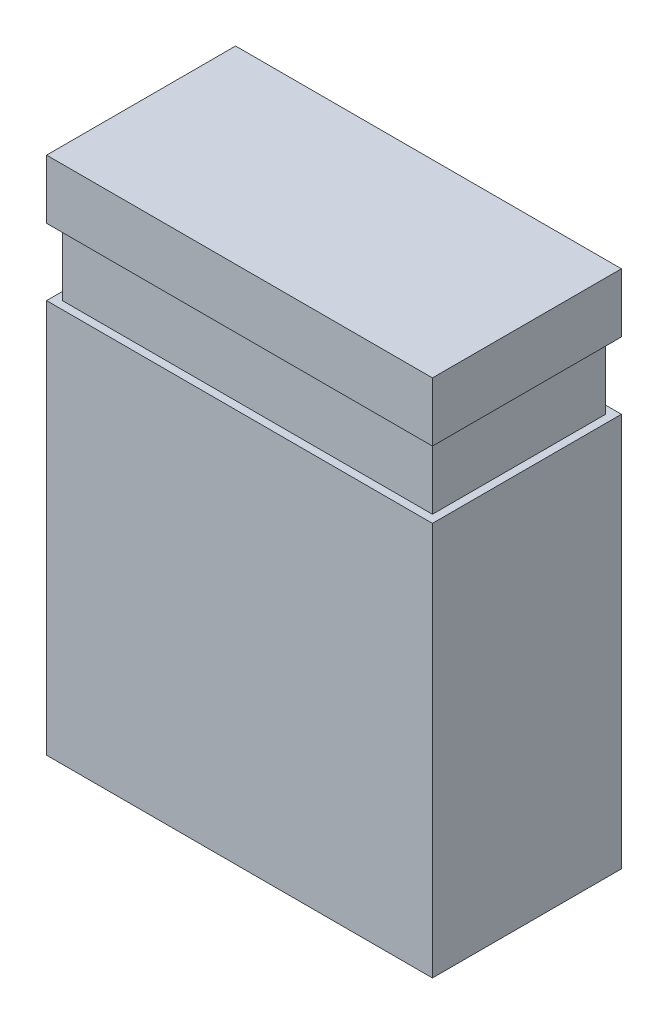
ISO-10303-21;
HEADER;
FILE_DESCRIPTION(('STEP AP214'),'2;1');
FILE_NAME('part.step','',(''),(''),'','','');
FILE_SCHEMA(('AUTOMOTIVE_DESIGN { 1 0 10303 214 1 1 1 1 }'));
ENDSEC;
DATA;
#1=APPLICATION_CONTEXT('core data for automotive mechanical design processes');
#2=APPLICATION_PROTOCOL_DEFINITION('international standard','automotive_design',2000,#1);
#3=PRODUCT_CONTEXT('',#1,'mechanical');
#4=PRODUCT('Part','Part','',(#3));
#5=PRODUCT_RELATED_PRODUCT_CATEGORY('part','',(#4));
#6=PRODUCT_DEFINITION_FORMATION('','',#4);
#7=PRODUCT_DEFINITION_CONTEXT('part definition',#1,'design');
#8=PRODUCT_DEFINITION('design','',#6,#7);
#9=PRODUCT_DEFINITION_SHAPE('','',#8);
#10=(LENGTH_UNIT() NAMED_UNIT(*) SI_UNIT(.MILLI.,.METRE.));
#11=(NAMED_UNIT(*) PLANE_ANGLE_UNIT() SI_UNIT($,.RADIAN.));
#12=(NAMED_UNIT(*) SI_UNIT($,.STERADIAN.) SOLID_ANGLE_UNIT());
#13=UNCERTAINTY_MEASURE_WITH_UNIT(LENGTH_MEASURE(1.E-05),#10,'distance_accuracy_value','');
#14=(GEOMETRIC_REPRESENTATION_CONTEXT(3) GLOBAL_UNCERTAINTY_ASSIGNED_CONTEXT((#13)) GLOBAL_UNIT_ASSIGNED_CONTEXT((#10,
#11,#12)) REPRESENTATION_CONTEXT('',''));
#15=CARTESIAN_POINT('',(0.,0.,0.));
#16=DIRECTION('',(0.,0.,1.));
#17=DIRECTION('',(1.,0.,0.));
#18=AXIS2_PLACEMENT_3D('',#15,#16,#17);
#19=CARTESIAN_POINT('',(-4.9,0.,2.4));
#20=DIRECTION('',(1.,0.,0.));
#21=DIRECTION('',(0.,0.,-1.));
#22=AXIS2_PLACEMENT_3D('',#19,#20,#21);
#23=PLANE('',#22);
#24=DIRECTION('',(0.,-1.,0.));
#25=VECTOR('',#24,1.);
#26=CARTESIAN_POINT('',(-4.9,0.,0.));
#27=LINE('',#26,#25);
#28=CARTESIAN_POINT('',(-4.9,6.6,0.));
#29=VERTEX_POINT('',#28);
#30=CARTESIAN_POINT('',(-4.9,5.85,0.));
#31=VERTEX_POINT('',#30);
#32=EDGE_CURVE('E196',#29,#31,#27,.T.);
#33=ORIENTED_EDGE('',*,*,#32,.T.);
#34=DIRECTION('',(0.,0.,1.));
#35=VECTOR('',#34,1.);
#36=CARTESIAN_POINT('',(-4.9,5.85,2.3));
#37=LINE('',#36,#35);
#38=CARTESIAN_POINT('',(-4.9,5.85,2.4));
#39=VERTEX_POINT('',#38);
#40=EDGE_CURVE('E167',#31,#39,#37,.T.);
#41=ORIENTED_EDGE('',*,*,#40,.T.);
#42=DIRECTION('',(0.,-1.,0.));
#43=VECTOR('',#42,1.);
#44=CARTESIAN_POINT('',(-4.9,0.,2.4));
#45=LINE('',#44,#43);
#46=CARTESIAN_POINT('',(-4.9,6.6,2.4));
#47=VERTEX_POINT('',#46);
#48=EDGE_CURVE('E184',#47,#39,#45,.T.);
#49=ORIENTED_EDGE('',*,*,#48,.F.);
#50=DIRECTION('',(0.,0.,-1.));
#51=VECTOR('',#50,1.);
#52=CARTESIAN_POINT('',(-4.9,6.6,2.4));
#53=LINE('',#52,#51);
#54=EDGE_CURVE('E42',#47,#29,#53,.T.);
#55=ORIENTED_EDGE('',*,*,#54,.T.);
#56=EDGE_LOOP('',(#33,#41,#49,#55));
#57=FACE_BOUND('',#56,.T.);
#58=ADVANCED_FACE('F34',(#57),#23,.F.);
#59=CARTESIAN_POINT('',(0.,0.,0.));
#60=DIRECTION('',(0.,0.,1.));
#61=DIRECTION('',(1.,0.,0.));
#62=AXIS2_PLACEMENT_3D('',#59,#60,#61);
#63=PLANE('',#62);
#64=DIRECTION('',(1.,0.,0.));
#65=VECTOR('',#64,1.);
#66=CARTESIAN_POINT('',(-0.1,5.85,0.));
#67=LINE('',#66,#65);
#68=CARTESIAN_POINT('',(0.,5.85,0.));
#69=VERTEX_POINT('',#68);
#70=EDGE_CURVE('E153',#31,#69,#67,.T.);
#71=ORIENTED_EDGE('',*,*,#70,.F.);
#72=ORIENTED_EDGE('',*,*,#32,.F.);
#73=DIRECTION('',(-1.,0.,0.));
#74=VECTOR('',#73,1.);
#75=CARTESIAN_POINT('',(0.,6.6,0.));
#76=LINE('',#75,#74);
#77=CARTESIAN_POINT('',(0.,6.6,0.));
#78=VERTEX_POINT('',#77);
#79=EDGE_CURVE('E193',#78,#29,#76,.T.);
#80=ORIENTED_EDGE('',*,*,#79,.F.);
#81=DIRECTION('',(0.,1.,0.));
#82=VECTOR('',#81,1.);
#83=CARTESIAN_POINT('',(0.,0.,0.));
#84=LINE('',#83,#82);
#85=EDGE_CURVE('E170',#69,#78,#84,.T.);
#86=ORIENTED_EDGE('',*,*,#85,.F.);
#87=EDGE_LOOP('',(#71,#72,#80,#86));
#88=FACE_BOUND('',#87,.T.);
#89=ADVANCED_FACE('F215',(#88),#63,.F.);
#90=CARTESIAN_POINT('',(0.,0.,2.4));
#91=DIRECTION('',(-1.,0.,0.));
#92=DIRECTION('',(0.,0.,1.));
#93=AXIS2_PLACEMENT_3D('',#90,#91,#92);
#94=PLANE('',#93);
#95=DIRECTION('',(0.,0.,1.));
#96=VECTOR('',#95,1.);
#97=CARTESIAN_POINT('',(0.,5.85,2.3));
#98=LINE('',#97,#96);
#99=CARTESIAN_POINT('',(0.,5.85,2.4));
#100=VERTEX_POINT('',#99);
#101=EDGE_CURVE('E171',#69,#100,#98,.T.);
#102=ORIENTED_EDGE('',*,*,#101,.F.);
#103=ORIENTED_EDGE('',*,*,#85,.T.);
#104=DIRECTION('',(0.,0.,-1.));
#105=VECTOR('',#104,1.);
#106=CARTESIAN_POINT('',(0.,6.6,2.4));
#107=LINE('',#106,#105);
#108=CARTESIAN_POINT('',(0.,6.6,2.4));
#109=VERTEX_POINT('',#108);
#110=EDGE_CURVE('E11',#109,#78,#107,.T.);
#111=ORIENTED_EDGE('',*,*,#110,.F.);
#112=DIRECTION('',(0.,1.,0.));
#113=VECTOR('',#112,1.);
#114=CARTESIAN_POINT('',(0.,0.,2.4));
#115=LINE('',#114,#113);
#116=EDGE_CURVE('E181',#100,#109,#115,.T.);
#117=ORIENTED_EDGE('',*,*,#116,.F.);
#118=EDGE_LOOP('',(#102,#103,#111,#117));
#119=FACE_BOUND('',#118,.T.);
#120=ADVANCED_FACE('F227',(#119),#94,.F.);
#121=CARTESIAN_POINT('',(0.,0.,2.4));
#122=DIRECTION('',(0.,0.,1.));
#123=DIRECTION('',(1.,0.,0.));
#124=AXIS2_PLACEMENT_3D('',#121,#122,#123);
#125=PLANE('',#124);
#126=DIRECTION('',(-1.,0.,0.));
#127=VECTOR('',#126,1.);
#128=CARTESIAN_POINT('',(-4.9,5.85,2.4));
#129=LINE('',#128,#127);
#130=EDGE_CURVE('E161',#100,#39,#129,.T.);
#131=ORIENTED_EDGE('',*,*,#130,.F.);
#132=ORIENTED_EDGE('',*,*,#116,.T.);
#133=DIRECTION('',(-1.,0.,0.));
#134=VECTOR('',#133,1.);
#135=CARTESIAN_POINT('',(0.,6.6,2.4));
#136=LINE('',#135,#134);
#137=EDGE_CURVE('E180',#109,#47,#136,.T.);
#138=ORIENTED_EDGE('',*,*,#137,.T.);
#139=ORIENTED_EDGE('',*,*,#48,.T.);
#140=EDGE_LOOP('',(#131,#132,#138,#139));
#141=FACE_BOUND('',#140,.T.);
#142=ADVANCED_FACE('F222',(#141),#125,.T.);
#143=CARTESIAN_POINT('',(0.,0.,0.));
#144=VERTEX_POINT('',#143);
#145=CARTESIAN_POINT('',(0.,5.,0.));
#146=VERTEX_POINT('',#145);
#147=EDGE_CURVE('E190',#144,#146,#84,.T.);
#148=ORIENTED_EDGE('',*,*,#147,.T.);
#149=DIRECTION('',(0.,0.,1.));
#150=VECTOR('',#149,1.);
#151=CARTESIAN_POINT('',(0.,5.,2.3));
#152=LINE('',#151,#150);
#153=CARTESIAN_POINT('',(0.,5.,2.4));
#154=VERTEX_POINT('',#153);
#155=EDGE_CURVE('E173',#146,#154,#152,.T.);
#156=ORIENTED_EDGE('',*,*,#155,.T.);
#157=CARTESIAN_POINT('',(0.,0.,2.4));
#158=VERTEX_POINT('',#157);
#159=EDGE_CURVE('E177',#158,#154,#115,.T.);
#160=ORIENTED_EDGE('',*,*,#159,.F.);
#161=DIRECTION('',(0.,0.,-1.));
#162=VECTOR('',#161,1.);
#163=CARTESIAN_POINT('',(0.,0.,2.4));
#164=LINE('',#163,#162);
#165=EDGE_CURVE('E189',#158,#144,#164,.T.);
#166=ORIENTED_EDGE('',*,*,#165,.T.);
#167=EDGE_LOOP('',(#148,#156,#160,#166));
#168=FACE_BOUND('',#167,.T.);
#169=ADVANCED_FACE('F36',(#168),#94,.F.);
#170=CARTESIAN_POINT('',(0.,6.6,2.4));
#171=DIRECTION('',(0.,-1.,0.));
#172=DIRECTION('',(1.,0.,0.));
#173=AXIS2_PLACEMENT_3D('',#170,#171,#172);
#174=PLANE('',#173);
#175=ORIENTED_EDGE('',*,*,#79,.T.);
#176=ORIENTED_EDGE('',*,*,#54,.F.);
#177=ORIENTED_EDGE('',*,*,#137,.F.);
#178=ORIENTED_EDGE('',*,*,#110,.T.);
#179=EDGE_LOOP('',(#175,#176,#177,#178));
#180=FACE_BOUND('',#179,.T.);
#181=ADVANCED_FACE('F225',(#180),#174,.F.);
#182=DIRECTION('',(0.,0.,1.));
#183=VECTOR('',#182,1.);
#184=CARTESIAN_POINT('',(-4.9,5.,2.3));
#185=LINE('',#184,#183);
#186=CARTESIAN_POINT('',(-4.9,5.,0.));
#187=VERTEX_POINT('',#186);
#188=CARTESIAN_POINT('',(-4.9,5.,2.4));
#189=VERTEX_POINT('',#188);
#190=EDGE_CURVE('E164',#187,#189,#185,.T.);
#191=ORIENTED_EDGE('',*,*,#190,.F.);
#192=CARTESIAN_POINT('',(-4.9,0.,0.));
#193=VERTEX_POINT('',#192);
#194=EDGE_CURVE('E195',#187,#193,#27,.T.);
#195=ORIENTED_EDGE('',*,*,#194,.T.);
#196=DIRECTION('',(0.,0.,-1.));
#197=VECTOR('',#196,1.);
#198=CARTESIAN_POINT('',(-4.9,0.,2.4));
#199=LINE('',#198,#197);
#200=CARTESIAN_POINT('',(-4.9,0.,2.4));
#201=VERTEX_POINT('',#200);
#202=EDGE_CURVE('E203',#201,#193,#199,.T.);
#203=ORIENTED_EDGE('',*,*,#202,.F.);
#204=EDGE_CURVE('E183',#189,#201,#45,.T.);
#205=ORIENTED_EDGE('',*,*,#204,.F.);
#206=EDGE_LOOP('',(#191,#195,#203,#205));
#207=FACE_BOUND('',#206,.T.);
#208=ADVANCED_FACE('F241',(#207),#23,.F.);
#209=CARTESIAN_POINT('',(0.,0.,2.4));
#210=DIRECTION('',(0.,1.,0.));
#211=DIRECTION('',(0.,0.,1.));
#212=AXIS2_PLACEMENT_3D('',#209,#210,#211);
#213=PLANE('',#212);
#214=DIRECTION('',(1.,0.,0.));
#215=VECTOR('',#214,1.);
#216=CARTESIAN_POINT('',(0.,0.,0.));
#217=LINE('',#216,#215);
#218=EDGE_CURVE('E199',#193,#144,#217,.T.);
#219=ORIENTED_EDGE('',*,*,#218,.T.);
#220=ORIENTED_EDGE('',*,*,#165,.F.);
#221=DIRECTION('',(1.,0.,0.));
#222=VECTOR('',#221,1.);
#223=CARTESIAN_POINT('',(0.,0.,2.4));
#224=LINE('',#223,#222);
#225=EDGE_CURVE('E187',#201,#158,#224,.T.);
#226=ORIENTED_EDGE('',*,*,#225,.F.);
#227=ORIENTED_EDGE('',*,*,#202,.T.);
#228=EDGE_LOOP('',(#219,#220,#226,#227));
#229=FACE_BOUND('',#228,.T.);
#230=ADVANCED_FACE('F246',(#229),#213,.F.);
#231=DIRECTION('',(1.,0.,0.));
#232=VECTOR('',#231,1.);
#233=CARTESIAN_POINT('',(-4.9,5.,2.4));
#234=LINE('',#233,#232);
#235=EDGE_CURVE('E156',#189,#154,#234,.T.);
#236=ORIENTED_EDGE('',*,*,#235,.F.);
#237=ORIENTED_EDGE('',*,*,#204,.T.);
#238=ORIENTED_EDGE('',*,*,#225,.T.);
#239=ORIENTED_EDGE('',*,*,#159,.T.);
#240=EDGE_LOOP('',(#236,#237,#238,#239));
#241=FACE_BOUND('',#240,.T.);
#242=ADVANCED_FACE('F234',(#241),#125,.T.);
#243=ORIENTED_EDGE('',*,*,#194,.F.);
#244=DIRECTION('',(1.,0.,0.));
#245=VECTOR('',#244,1.);
#246=CARTESIAN_POINT('',(-0.1,5.,0.));
#247=LINE('',#246,#245);
#248=EDGE_CURVE('E152',#187,#146,#247,.T.);
#249=ORIENTED_EDGE('',*,*,#248,.T.);
#250=ORIENTED_EDGE('',*,*,#147,.F.);
#251=ORIENTED_EDGE('',*,*,#218,.F.);
#252=EDGE_LOOP('',(#243,#249,#250,#251));
#253=FACE_BOUND('',#252,.T.);
#254=ADVANCED_FACE('F236',(#253),#63,.F.);
#255=CARTESIAN_POINT('',(-4.9,5.85,2.3));
#256=DIRECTION('',(0.,1.,0.));
#257=DIRECTION('',(0.,0.,1.));
#258=AXIS2_PLACEMENT_3D('',#255,#256,#257);
#259=PLANE('',#258);
#260=ORIENTED_EDGE('',*,*,#40,.F.);
#261=ORIENTED_EDGE('',*,*,#70,.T.);
#262=ORIENTED_EDGE('',*,*,#101,.T.);
#263=ORIENTED_EDGE('',*,*,#130,.T.);
#264=EDGE_LOOP('',(#260,#261,#262,#263));
#265=FACE_BOUND('',#264,.T.);
#266=DIRECTION('',(0.,0.,-1.));
#267=VECTOR('',#266,1.);
#268=CARTESIAN_POINT('',(-4.8,5.85,0.1));
#269=LINE('',#268,#267);
#270=CARTESIAN_POINT('',(-4.8,5.85,2.3));
#271=VERTEX_POINT('',#270);
#272=CARTESIAN_POINT('',(-4.8,5.85,0.1));
#273=VERTEX_POINT('',#272);
#274=EDGE_CURVE('E49',#271,#273,#269,.T.);
#275=ORIENTED_EDGE('',*,*,#274,.F.);
#276=DIRECTION('',(-1.,0.,0.));
#277=VECTOR('',#276,1.);
#278=CARTESIAN_POINT('',(-4.9,5.85,2.3));
#279=LINE('',#278,#277);
#280=CARTESIAN_POINT('',(-0.1,5.85,2.3));
#281=VERTEX_POINT('',#280);
#282=EDGE_CURVE('E160',#281,#271,#279,.T.);
#283=ORIENTED_EDGE('',*,*,#282,.F.);
#284=DIRECTION('',(0.,0.,1.));
#285=VECTOR('',#284,1.);
#286=CARTESIAN_POINT('',(-0.1,5.85,2.3));
#287=LINE('',#286,#285);
#288=CARTESIAN_POINT('',(-0.1,5.85,0.0999999999999998));
#289=VERTEX_POINT('',#288);
#290=EDGE_CURVE('E150',#289,#281,#287,.T.);
#291=ORIENTED_EDGE('',*,*,#290,.F.);
#292=DIRECTION('',(1.,0.,0.));
#293=VECTOR('',#292,1.);
#294=CARTESIAN_POINT('',(-0.1,5.85,0.1));
#295=LINE('',#294,#293);
#296=EDGE_CURVE('E56',#273,#289,#295,.T.);
#297=ORIENTED_EDGE('',*,*,#296,.F.);
#298=EDGE_LOOP('',(#275,#283,#291,#297));
#299=FACE_BOUND('',#298,.T.);
#300=ADVANCED_FACE('F218',(#265,#299),#259,.F.);
#301=CARTESIAN_POINT('',(-4.9,5.,2.3));
#302=DIRECTION('',(0.,-1.,0.));
#303=DIRECTION('',(0.,0.,-1.));
#304=AXIS2_PLACEMENT_3D('',#301,#302,#303);
#305=PLANE('',#304);
#306=DIRECTION('',(1.,0.,0.));
#307=VECTOR('',#306,1.);
#308=CARTESIAN_POINT('',(-4.9,5.,2.3));
#309=LINE('',#308,#307);
#310=CARTESIAN_POINT('',(-4.8,5.,2.3));
#311=VERTEX_POINT('',#310);
#312=CARTESIAN_POINT('',(-0.1,5.,2.3));
#313=VERTEX_POINT('',#312);
#314=EDGE_CURVE('E130',#311,#313,#309,.T.);
#315=ORIENTED_EDGE('',*,*,#314,.F.);
#316=DIRECTION('',(0.,0.,1.));
#317=VECTOR('',#316,1.);
#318=CARTESIAN_POINT('',(-4.8,5.,0.1));
#319=LINE('',#318,#317);
#320=CARTESIAN_POINT('',(-4.8,5.,0.1));
#321=VERTEX_POINT('',#320);
#322=EDGE_CURVE('E124',#321,#311,#319,.T.);
#323=ORIENTED_EDGE('',*,*,#322,.F.);
#324=DIRECTION('',(-1.,0.,0.));
#325=VECTOR('',#324,1.);
#326=CARTESIAN_POINT('',(-0.1,5.,0.1));
#327=LINE('',#326,#325);
#328=CARTESIAN_POINT('',(-0.1,5.,0.1));
#329=VERTEX_POINT('',#328);
#330=EDGE_CURVE('E129',#329,#321,#327,.T.);
#331=ORIENTED_EDGE('',*,*,#330,.F.);
#332=DIRECTION('',(0.,0.,-1.));
#333=VECTOR('',#332,1.);
#334=CARTESIAN_POINT('',(-0.1,5.,2.3));
#335=LINE('',#334,#333);
#336=EDGE_CURVE('E148',#313,#329,#335,.T.);
#337=ORIENTED_EDGE('',*,*,#336,.F.);
#338=EDGE_LOOP('',(#315,#323,#331,#337));
#339=FACE_BOUND('',#338,.T.);
#340=ORIENTED_EDGE('',*,*,#235,.T.);
#341=ORIENTED_EDGE('',*,*,#155,.F.);
#342=ORIENTED_EDGE('',*,*,#248,.F.);
#343=ORIENTED_EDGE('',*,*,#190,.T.);
#344=EDGE_LOOP('',(#340,#341,#342,#343));
#345=FACE_BOUND('',#344,.T.);
#346=ADVANCED_FACE('F125',(#339,#345),#305,.F.);
#347=CARTESIAN_POINT('',(0.,0.,2.3));
#348=DIRECTION('',(0.,0.,-1.));
#349=DIRECTION('',(-1.,0.,0.));
#350=AXIS2_PLACEMENT_3D('',#347,#348,#349);
#351=PLANE('',#350);
#352=ORIENTED_EDGE('',*,*,#282,.T.);
#353=DIRECTION('',(0.,1.,0.));
#354=VECTOR('',#353,1.);
#355=CARTESIAN_POINT('',(-4.8,5.,2.3));
#356=LINE('',#355,#354);
#357=EDGE_CURVE('E132',#311,#271,#356,.T.);
#358=ORIENTED_EDGE('',*,*,#357,.F.);
#359=ORIENTED_EDGE('',*,*,#314,.T.);
#360=DIRECTION('',(0.,-1.,0.));
#361=VECTOR('',#360,1.);
#362=CARTESIAN_POINT('',(-0.1,5.,2.3));
#363=LINE('',#362,#361);
#364=EDGE_CURVE('E141',#281,#313,#363,.T.);
#365=ORIENTED_EDGE('',*,*,#364,.F.);
#366=EDGE_LOOP('',(#352,#358,#359,#365));
#367=FACE_BOUND('',#366,.T.);
#368=ADVANCED_FACE('F272',(#367),#351,.F.);
#369=CARTESIAN_POINT('',(-0.1,0.,0.));
#370=DIRECTION('',(-1.,0.,0.));
#371=DIRECTION('',(0.,0.,1.));
#372=AXIS2_PLACEMENT_3D('',#369,#370,#371);
#373=PLANE('',#372);
#374=ORIENTED_EDGE('',*,*,#336,.T.);
#375=DIRECTION('',(0.,-1.,0.));
#376=VECTOR('',#375,1.);
#377=CARTESIAN_POINT('',(-0.1,5.,0.1));
#378=LINE('',#377,#376);
#379=EDGE_CURVE('E138',#289,#329,#378,.T.);
#380=ORIENTED_EDGE('',*,*,#379,.F.);
#381=ORIENTED_EDGE('',*,*,#290,.T.);
#382=ORIENTED_EDGE('',*,*,#364,.T.);
#383=EDGE_LOOP('',(#374,#380,#381,#382));
#384=FACE_BOUND('',#383,.T.);
#385=ADVANCED_FACE('F277',(#384),#373,.F.);
#386=CARTESIAN_POINT('',(0.,0.,0.1));
#387=DIRECTION('',(0.,0.,1.));
#388=DIRECTION('',(1.,0.,0.));
#389=AXIS2_PLACEMENT_3D('',#386,#387,#388);
#390=PLANE('',#389);
#391=ORIENTED_EDGE('',*,*,#330,.T.);
#392=DIRECTION('',(0.,-1.,0.));
#393=VECTOR('',#392,1.);
#394=CARTESIAN_POINT('',(-4.8,5.,0.1));
#395=LINE('',#394,#393);
#396=EDGE_CURVE('E133',#273,#321,#395,.T.);
#397=ORIENTED_EDGE('',*,*,#396,.F.);
#398=ORIENTED_EDGE('',*,*,#296,.T.);
#399=ORIENTED_EDGE('',*,*,#379,.T.);
#400=EDGE_LOOP('',(#391,#397,#398,#399));
#401=FACE_BOUND('',#400,.T.);
#402=ADVANCED_FACE('F137',(#401),#390,.F.);
#403=CARTESIAN_POINT('',(-4.8,0.,0.));
#404=DIRECTION('',(1.,0.,0.));
#405=DIRECTION('',(0.,0.,-1.));
#406=AXIS2_PLACEMENT_3D('',#403,#404,#405);
#407=PLANE('',#406);
#408=ORIENTED_EDGE('',*,*,#396,.T.);
#409=ORIENTED_EDGE('',*,*,#322,.T.);
#410=ORIENTED_EDGE('',*,*,#357,.T.);
#411=ORIENTED_EDGE('',*,*,#274,.T.);
#412=EDGE_LOOP('',(#408,#409,#410,#411));
#413=FACE_BOUND('',#412,.T.);
#414=ADVANCED_FACE('F135',(#413),#407,.F.);
#415=CLOSED_SHELL('',(#58,#89,#120,#142,#169,#181,#208,#230,#242,#254,#300,#346,#368,#385,#402,#414));
#416=MANIFOLD_SOLID_BREP('B2',#415);
#417=ADVANCED_BREP_SHAPE_REPRESENTATION('',(#18,#416),#14);
#418=SHAPE_DEFINITION_REPRESENTATION(#9,#417);
ENDSEC;
END-ISO-10303-21;
